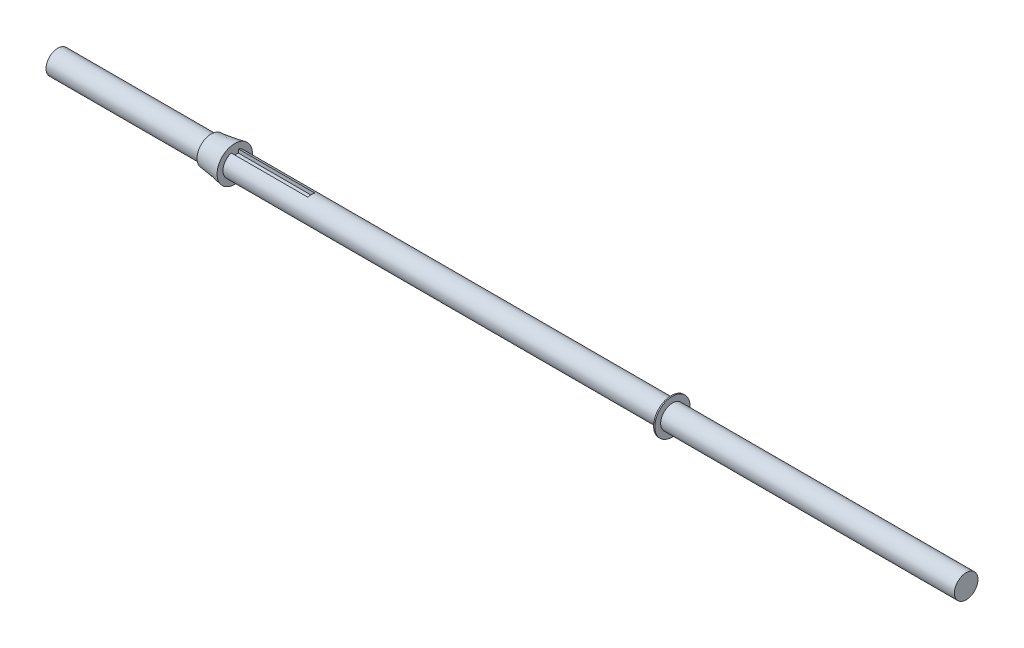
ISO-10303-21;
HEADER;
FILE_DESCRIPTION(('STEP AP214'),'2;1');
FILE_NAME('part.step','',(''),(''),'','','');
FILE_SCHEMA(('AUTOMOTIVE_DESIGN { 1 0 10303 214 1 1 1 1 }'));
ENDSEC;
DATA;
#1=APPLICATION_CONTEXT('core data for automotive mechanical design processes');
#2=APPLICATION_PROTOCOL_DEFINITION('international standard','automotive_design',2000,#1);
#3=PRODUCT_CONTEXT('',#1,'mechanical');
#4=PRODUCT('Part','Part','',(#3));
#5=PRODUCT_RELATED_PRODUCT_CATEGORY('part','',(#4));
#6=PRODUCT_DEFINITION_FORMATION('','',#4);
#7=PRODUCT_DEFINITION_CONTEXT('part definition',#1,'design');
#8=PRODUCT_DEFINITION('design','',#6,#7);
#9=PRODUCT_DEFINITION_SHAPE('','',#8);
#10=(LENGTH_UNIT() NAMED_UNIT(*) SI_UNIT(.MILLI.,.METRE.));
#11=(NAMED_UNIT(*) PLANE_ANGLE_UNIT() SI_UNIT($,.RADIAN.));
#12=(NAMED_UNIT(*) SI_UNIT($,.STERADIAN.) SOLID_ANGLE_UNIT());
#13=UNCERTAINTY_MEASURE_WITH_UNIT(LENGTH_MEASURE(1.E-05),#10,'distance_accuracy_value','');
#14=(GEOMETRIC_REPRESENTATION_CONTEXT(3) GLOBAL_UNCERTAINTY_ASSIGNED_CONTEXT((#13)) GLOBAL_UNIT_ASSIGNED_CONTEXT((#10,
#11,#12)) REPRESENTATION_CONTEXT('',''));
#15=CARTESIAN_POINT('',(0.,0.,0.));
#16=DIRECTION('',(0.,0.,1.));
#17=DIRECTION('',(1.,0.,0.));
#18=AXIS2_PLACEMENT_3D('',#15,#16,#17);
#19=CARTESIAN_POINT('',(750.,0.,0.));
#20=DIRECTION('',(-1.,0.,0.));
#21=DIRECTION('',(0.,0.,1.));
#22=AXIS2_PLACEMENT_3D('',#19,#20,#21);
#23=CYLINDRICAL_SURFACE('',#22,10.);
#24=CARTESIAN_POINT('',(500.,0.,0.));
#25=DIRECTION('',(1.,0.,0.));
#26=DIRECTION('',(0.,0.,-1.));
#27=AXIS2_PLACEMENT_3D('',#24,#25,#26);
#28=CIRCLE('',#27,10.);
#29=CARTESIAN_POINT('',(500.,0.,-10.));
#30=VERTEX_POINT('',#29);
#31=EDGE_CURVE('E57',#30,#30,#28,.T.);
#32=ORIENTED_EDGE('',*,*,#31,.F.);
#33=EDGE_LOOP('',(#32));
#34=FACE_BOUND('',#33,.T.);
#35=DIRECTION('',(-1.,0.,0.));
#36=VECTOR('',#35,1.);
#37=CARTESIAN_POINT('',(750.,9.53939201416946,-3.));
#38=LINE('',#37,#36);
#39=CARTESIAN_POINT('',(195.,9.53939201416946,-3.));
#40=VERTEX_POINT('',#39);
#41=CARTESIAN_POINT('',(130.,9.53939201416946,-3.));
#42=VERTEX_POINT('',#41);
#43=EDGE_CURVE('E115',#40,#42,#38,.T.);
#44=ORIENTED_EDGE('',*,*,#43,.F.);
#45=CARTESIAN_POINT('',(195.,0.,0.));
#46=DIRECTION('',(-1.,0.,0.));
#47=DIRECTION('',(0.,0.,1.));
#48=AXIS2_PLACEMENT_3D('',#45,#46,#47);
#49=CIRCLE('',#48,10.);
#50=CARTESIAN_POINT('',(195.,9.53939201416946,3.));
#51=VERTEX_POINT('',#50);
#52=EDGE_CURVE('E12',#51,#40,#49,.T.);
#53=ORIENTED_EDGE('',*,*,#52,.F.);
#54=DIRECTION('',(-1.,0.,0.));
#55=VECTOR('',#54,1.);
#56=CARTESIAN_POINT('',(750.,9.53939201416946,3.));
#57=LINE('',#56,#55);
#58=CARTESIAN_POINT('',(130.,9.53939201416946,3.));
#59=VERTEX_POINT('',#58);
#60=EDGE_CURVE('E109',#51,#59,#57,.T.);
#61=ORIENTED_EDGE('',*,*,#60,.T.);
#62=CARTESIAN_POINT('',(130.,0.,0.));
#63=DIRECTION('',(1.,0.,0.));
#64=DIRECTION('',(0.,0.,-1.));
#65=AXIS2_PLACEMENT_3D('',#62,#63,#64);
#66=CIRCLE('',#65,10.);
#67=EDGE_CURVE('E207',#59,#42,#66,.T.);
#68=ORIENTED_EDGE('',*,*,#67,.T.);
#69=EDGE_LOOP('',(#44,#53,#61,#68));
#70=FACE_BOUND('',#69,.T.);
#71=ADVANCED_FACE('F48',(#34,#70),#23,.T.);
#72=CARTESIAN_POINT('',(110.,0.,0.));
#73=DIRECTION('',(1.,0.,0.));
#74=DIRECTION('',(0.,0.,-1.));
#75=AXIS2_PLACEMENT_3D('',#72,#73,#74);
#76=CIRCLE('',#75,10.);
#77=CARTESIAN_POINT('',(110.,0.,-10.));
#78=VERTEX_POINT('',#77);
#79=EDGE_CURVE('E214',#78,#78,#76,.T.);
#80=ORIENTED_EDGE('',*,*,#79,.F.);
#81=EDGE_LOOP('',(#80));
#82=FACE_BOUND('',#81,.T.);
#83=CARTESIAN_POINT('',(-20.,0.,0.));
#84=DIRECTION('',(-1.,0.,0.));
#85=DIRECTION('',(0.,0.,1.));
#86=AXIS2_PLACEMENT_3D('',#83,#84,#85);
#87=CIRCLE('',#86,10.);
#88=CARTESIAN_POINT('',(-20.,0.,10.));
#89=VERTEX_POINT('',#88);
#90=EDGE_CURVE('E123',#89,#89,#87,.T.);
#91=ORIENTED_EDGE('',*,*,#90,.F.);
#92=EDGE_LOOP('',(#91));
#93=FACE_BOUND('',#92,.T.);
#94=ADVANCED_FACE('F250',(#82,#93),#23,.T.);
#95=CARTESIAN_POINT('',(110.,0.,0.));
#96=DIRECTION('',(1.,0.,0.));
#97=DIRECTION('',(0.,0.,-1.));
#98=AXIS2_PLACEMENT_3D('',#95,#96,#97);
#99=PLANE('',#98);
#100=ORIENTED_EDGE('',*,*,#79,.T.);
#101=EDGE_LOOP('',(#100));
#102=FACE_BOUND('',#101,.T.);
#103=CARTESIAN_POINT('',(110.,0.,0.));
#104=DIRECTION('',(1.,0.,0.));
#105=DIRECTION('',(0.,0.,-1.));
#106=AXIS2_PLACEMENT_3D('',#103,#104,#105);
#107=CIRCLE('',#106,12.);
#108=CARTESIAN_POINT('',(110.,7.76467153883333,-9.14931013213738));
#109=VERTEX_POINT('',#108);
#110=EDGE_CURVE('E191',#109,#109,#107,.T.);
#111=ORIENTED_EDGE('',*,*,#110,.F.);
#112=EDGE_LOOP('',(#111));
#113=FACE_BOUND('',#112,.T.);
#114=ADVANCED_FACE('F163',(#102,#113),#99,.F.);
#115=CARTESIAN_POINT('',(130.,0.,0.));
#116=DIRECTION('',(1.,0.,0.));
#117=DIRECTION('',(0.,0.,-1.));
#118=AXIS2_PLACEMENT_3D('',#115,#116,#117);
#119=PLANE('',#118);
#120=ORIENTED_EDGE('',*,*,#67,.F.);
#121=DIRECTION('',(0.,1.,0.));
#122=VECTOR('',#121,1.);
#123=CARTESIAN_POINT('',(130.,6.5,3.));
#124=LINE('',#123,#122);
#125=CARTESIAN_POINT('',(130.,6.5,3.));
#126=VERTEX_POINT('',#125);
#127=EDGE_CURVE('E117',#126,#59,#124,.T.);
#128=ORIENTED_EDGE('',*,*,#127,.F.);
#129=DIRECTION('',(0.,0.,-1.));
#130=VECTOR('',#129,1.);
#131=CARTESIAN_POINT('',(130.,6.5,3.));
#132=LINE('',#131,#130);
#133=CARTESIAN_POINT('',(130.,6.5,-3.));
#134=VERTEX_POINT('',#133);
#135=EDGE_CURVE('E366',#126,#134,#132,.T.);
#136=ORIENTED_EDGE('',*,*,#135,.T.);
#137=DIRECTION('',(0.,1.,0.));
#138=VECTOR('',#137,1.);
#139=CARTESIAN_POINT('',(130.,6.5,-3.));
#140=LINE('',#139,#138);
#141=EDGE_CURVE('E64',#134,#42,#140,.T.);
#142=ORIENTED_EDGE('',*,*,#141,.T.);
#143=EDGE_LOOP('',(#120,#128,#136,#142));
#144=FACE_BOUND('',#143,.T.);
#145=CARTESIAN_POINT('',(130.,0.,0.));
#146=DIRECTION('',(1.,0.,0.));
#147=DIRECTION('',(0.,0.,-1.));
#148=AXIS2_PLACEMENT_3D('',#145,#146,#147);
#149=CIRCLE('',#148,15.);
#150=CARTESIAN_POINT('',(130.,13.4202752725021,-6.70046353697026));
#151=VERTEX_POINT('',#150);
#152=EDGE_CURVE('E140',#151,#151,#149,.T.);
#153=ORIENTED_EDGE('',*,*,#152,.T.);
#154=EDGE_LOOP('',(#153));
#155=FACE_BOUND('',#154,.T.);
#156=ADVANCED_FACE('F160',(#144,#155),#119,.T.);
#157=CARTESIAN_POINT('',(130.,13.4202752725021,-6.70046353697026));
#158=CARTESIAN_POINT('',(110.,7.76467153883333,-9.14931013213738));
#159=CARTESIAN_POINT('',(130.,0.0193481985615966,-33.5410140819745));
#160=CARTESIAN_POINT('',(110.,-10.5339487254414,-24.678653209804));
#161=CARTESIAN_POINT('',(130.,-26.8212023464427,-20.140087008034));
#162=CARTESIAN_POINT('',(110.,-26.0632918031081,-6.38003294552928));
#163=CARTESIAN_POINT('',(130.,-13.4202752725021,6.70046353697027));
#164=CARTESIAN_POINT('',(110.,-7.76467153883333,9.14931013213738));
#165=CARTESIAN_POINT('',(130.,-0.0193481985615931,33.5410140819745));
#166=CARTESIAN_POINT('',(110.,10.5339487254414,24.678653209804));
#167=CARTESIAN_POINT('',(130.,26.8212023464427,20.140087008034));
#168=CARTESIAN_POINT('',(110.,26.0632918031081,6.38003294552929));
#169=CARTESIAN_POINT('',(130.,13.4202752725021,-6.70046353697026));
#170=CARTESIAN_POINT('',(110.,7.76467153883333,-9.14931013213738));
#171=(BOUNDED_SURFACE() B_SPLINE_SURFACE(3,1,((#157,#158),(#159,#160),(#161,#162),(#163,#164),
(#165,#166),(#167,#168),(#169,#170)),.UNSPECIFIED.,.T.,.F.,.F.) B_SPLINE_SURFACE_WITH_KNOTS((4,
3,4),(2,2),(0.,0.5,1.),(0.,1.),
.UNSPECIFIED.) GEOMETRIC_REPRESENTATION_ITEM() RATIONAL_B_SPLINE_SURFACE(((1.,1.),
(0.333333333333333,0.333333333333333),(0.333333333333333,0.333333333333333),(1.,1.),
(0.333333333333333,0.333333333333333),(0.333333333333333,0.333333333333333),(1.,1.))) REPRESENTATION_ITEM('') SURFACE());
#172=CARTESIAN_POINT('',(130.,13.4202752725021,-6.70046353697026));
#173=CARTESIAN_POINT('',(129.791666666667,13.3613627336097,-6.72597235566992));
#174=CARTESIAN_POINT('',(129.583333333333,13.3024501947174,-6.75148117436958));
#175=CARTESIAN_POINT('',(129.166666666667,13.1846251169326,-6.80249881176889));
#176=CARTESIAN_POINT('',(128.958333333333,13.1257125780402,-6.82800763046855));
#177=CARTESIAN_POINT('',(128.541666666667,13.0078875002554,-6.87902526786787));
#178=CARTESIAN_POINT('',(128.333333333333,12.9489749613631,-6.90453408656752));
#179=CARTESIAN_POINT('',(127.916666666667,12.8311498835783,-6.95555172396684));
#180=CARTESIAN_POINT('',(127.708333333333,12.7722373446859,-6.9810605426665));
#181=CARTESIAN_POINT('',(127.291666666667,12.6544122669011,-7.03207818006581));
#182=CARTESIAN_POINT('',(127.083333333333,12.5954997280088,-7.05758699876547));
#183=CARTESIAN_POINT('',(126.666666666667,12.477674650224,-7.10860463616478));
#184=CARTESIAN_POINT('',(126.458333333333,12.4187621113316,-7.13411345486444));
#185=CARTESIAN_POINT('',(126.041666666667,12.3009370335468,-7.18513109226376));
#186=CARTESIAN_POINT('',(125.833333333333,12.2420244946545,-7.21063991096341));
#187=CARTESIAN_POINT('',(125.416666666667,12.1241994168697,-7.26165754836273));
#188=CARTESIAN_POINT('',(125.208333333333,12.0652868779773,-7.28716636706238));
#189=CARTESIAN_POINT('',(124.791666666667,11.9474618001925,-7.3381840044617));
#190=CARTESIAN_POINT('',(124.583333333333,11.8885492613002,-7.36369282316136));
#191=CARTESIAN_POINT('',(124.166666666667,11.7707241835154,-7.41471046056067));
#192=CARTESIAN_POINT('',(123.958333333333,11.711811644623,-7.44021927926033));
#193=CARTESIAN_POINT('',(123.541666666667,11.5939865668382,-7.49123691665964));
#194=CARTESIAN_POINT('',(123.333333333333,11.5350740279459,-7.5167457353593));
#195=CARTESIAN_POINT('',(122.916666666667,11.4172489501611,-7.56776337275862));
#196=CARTESIAN_POINT('',(122.708333333333,11.3583364112687,-7.59327219145827));
#197=CARTESIAN_POINT('',(122.291666666667,11.2405113334839,-7.64428982885759));
#198=CARTESIAN_POINT('',(122.083333333333,11.1815987945916,-7.66979864755725));
#199=CARTESIAN_POINT('',(121.666666666667,11.0637737168068,-7.72081628495656));
#200=CARTESIAN_POINT('',(121.458333333333,11.0048611779144,-7.74632510365622));
#201=CARTESIAN_POINT('',(121.041666666667,10.8870361001296,-7.79734274105553));
#202=CARTESIAN_POINT('',(120.833333333333,10.8281235612373,-7.82285155975519));
#203=CARTESIAN_POINT('',(120.416666666667,10.7102984834525,-7.87386919715451));
#204=CARTESIAN_POINT('',(120.208333333333,10.6513859445601,-7.89937801585416));
#205=CARTESIAN_POINT('',(119.791666666667,10.5335608667753,-7.95039565325348));
#206=CARTESIAN_POINT('',(119.583333333333,10.474648327883,-7.97590447195314));
#207=CARTESIAN_POINT('',(119.166666666667,10.3568232500982,-8.02692210935245));
#208=CARTESIAN_POINT('',(118.958333333333,10.2979107112058,-8.05243092805211));
#209=CARTESIAN_POINT('',(118.541666666667,10.180085633421,-8.10344856545142));
#210=CARTESIAN_POINT('',(118.333333333333,10.1211730945287,-8.12895738415108));
#211=CARTESIAN_POINT('',(117.916666666667,10.0033480167439,-8.1799750215504));
#212=CARTESIAN_POINT('',(117.708333333333,9.94443547785151,-8.20548384025005));
#213=CARTESIAN_POINT('',(117.291666666667,9.82661040006674,-8.25650147764937));
#214=CARTESIAN_POINT('',(117.083333333333,9.76769786117436,-8.28201029634902));
#215=CARTESIAN_POINT('',(116.666666666667,9.64987278338959,-8.33302793374834));
#216=CARTESIAN_POINT('',(116.458333333333,9.59096024449721,-8.358536752448));
#217=CARTESIAN_POINT('',(116.041666666667,9.47313516671244,-8.40955438984731));
#218=CARTESIAN_POINT('',(115.833333333333,9.41422262782006,-8.43506320854697));
#219=CARTESIAN_POINT('',(115.416666666667,9.29639755003529,-8.48608084594628));
#220=CARTESIAN_POINT('',(115.208333333333,9.23748501114291,-8.51158966464594));
#221=CARTESIAN_POINT('',(114.791666666667,9.11965993335814,-8.56260730204526));
#222=CARTESIAN_POINT('',(114.583333333333,9.06074739446576,-8.58811612074491));
#223=CARTESIAN_POINT('',(114.166666666667,8.942922316681,-8.63913375814423));
#224=CARTESIAN_POINT('',(113.958333333333,8.88400977778861,-8.66464257684389));
#225=CARTESIAN_POINT('',(113.541666666667,8.76618470000385,-8.7156602142432));
#226=CARTESIAN_POINT('',(113.333333333333,8.70727216111146,-8.74116903294286));
#227=CARTESIAN_POINT('',(112.916666666667,8.58944708332669,-8.79218667034217));
#228=CARTESIAN_POINT('',(112.708333333333,8.53053454443431,-8.81769548904183));
#229=CARTESIAN_POINT('',(112.291666666667,8.41270946664955,-8.86871312644115));
#230=CARTESIAN_POINT('',(112.083333333333,8.35379692775716,-8.8942219451408));
#231=CARTESIAN_POINT('',(111.666666666667,8.2359718499724,-8.94523958254012));
#232=CARTESIAN_POINT('',(111.458333333333,8.17705931108001,-8.97074840123977));
#233=CARTESIAN_POINT('',(111.041666666667,8.05923423329525,-9.02176603863909));
#234=CARTESIAN_POINT('',(110.833333333333,8.00032169440286,-9.04727485733875));
#235=CARTESIAN_POINT('',(110.416666666667,7.88249661661809,-9.09829249473807));
#236=CARTESIAN_POINT('',(110.208333333333,7.82358407772571,-9.12380131343772));
#237=CARTESIAN_POINT('',(110.,7.76467153883333,-9.14931013213738));
#238=B_SPLINE_CURVE_WITH_KNOTS('',3,(#172,#173,#174,#175,#176,#177,#178,#179,#180,#181,#182,
#183,#184,#185,#186,#187,#188,#189,#190,#191,#192,#193,#194,#195,#196,#197,#198,#199,#200,#201,
#202,#203,#204,#205,#206,#207,#208,#209,#210,#211,#212,#213,#214,#215,#216,#217,#218,#219,#220,
#221,#222,#223,#224,#225,#226,#227,#228,#229,#230,#231,#232,#233,#234,#235,#236,#237),
.UNSPECIFIED.,.F.,.F.,(4,2,2,2,2,2,2,2,2,2,2,2,2,2,2,2,2,2,2,2,2,2,2,2,2,2,2,2,2,2,2,2,4),(0.,
0.65400113427407,1.30800226854817,1.96200340282226,2.61600453709633,3.2700056713704,
3.9240068056445,4.5780079399186,5.23200907419267,5.88601020846674,6.54001134274082,
7.19401247701492,7.848013611289,8.50201474556307,9.15601587983717,9.81001701411125,
10.4640181483853,11.1180192826594,11.7720204169335,12.4260215512076,13.0800226854817,
13.7340238197557,14.3880249540298,15.0420260883039,15.696027222578,16.3500283568521,
17.0040294911262,17.6580306254002,18.3120317596743,18.9660328939484,19.6200340282225,
20.2740351624966,20.9280362967706),.UNSPECIFIED.);
#239=EDGE_CURVE('BSEAM147',#151,#109,#238,.T.);
#240=ORIENTED_EDGE('',*,*,#152,.F.);
#241=ORIENTED_EDGE('',*,*,#110,.T.);
#242=ORIENTED_EDGE('',*,*,#239,.T.);
#243=ORIENTED_EDGE('',*,*,#239,.F.);
#244=EDGE_LOOP('',(#240,#242,#241,#243));
#245=FACE_BOUND('',#244,.T.);
#246=ADVANCED_FACE('F147',(#245),#171,.T.);
#247=CARTESIAN_POINT('',(501.,0.,0.));
#248=DIRECTION('',(-1.,0.,0.));
#249=DIRECTION('',(0.,0.,1.));
#250=AXIS2_PLACEMENT_3D('',#247,#248,#249);
#251=CYLINDRICAL_SURFACE('',#250,15.);
#252=CARTESIAN_POINT('',(501.,0.,0.));
#253=DIRECTION('',(1.,0.,0.));
#254=DIRECTION('',(0.,0.,-1.));
#255=AXIS2_PLACEMENT_3D('',#252,#253,#254);
#256=CIRCLE('',#255,15.);
#257=CARTESIAN_POINT('',(501.,0.,-15.));
#258=VERTEX_POINT('',#257);
#259=EDGE_CURVE('E128',#258,#258,#256,.T.);
#260=ORIENTED_EDGE('',*,*,#259,.F.);
#261=EDGE_LOOP('',(#260));
#262=FACE_BOUND('',#261,.T.);
#263=CARTESIAN_POINT('',(500.,0.,0.));
#264=DIRECTION('',(1.,0.,0.));
#265=DIRECTION('',(0.,0.,-1.));
#266=AXIS2_PLACEMENT_3D('',#263,#264,#265);
#267=CIRCLE('',#266,15.);
#268=CARTESIAN_POINT('',(500.,0.,-15.));
#269=VERTEX_POINT('',#268);
#270=EDGE_CURVE('E127',#269,#269,#267,.T.);
#271=ORIENTED_EDGE('',*,*,#270,.T.);
#272=EDGE_LOOP('',(#271));
#273=FACE_BOUND('',#272,.T.);
#274=ADVANCED_FACE('F159',(#262,#273),#251,.T.);
#275=CARTESIAN_POINT('',(501.,0.,0.));
#276=DIRECTION('',(1.,0.,0.));
#277=DIRECTION('',(0.,0.,-1.));
#278=AXIS2_PLACEMENT_3D('',#275,#276,#277);
#279=PLANE('',#278);
#280=CARTESIAN_POINT('',(501.,0.,0.));
#281=DIRECTION('',(1.,0.,0.));
#282=DIRECTION('',(0.,0.,-1.));
#283=AXIS2_PLACEMENT_3D('',#280,#281,#282);
#284=CIRCLE('',#283,10.);
#285=CARTESIAN_POINT('',(501.,0.,-10.));
#286=VERTEX_POINT('',#285);
#287=EDGE_CURVE('E132',#286,#286,#284,.T.);
#288=ORIENTED_EDGE('',*,*,#287,.F.);
#289=EDGE_LOOP('',(#288));
#290=FACE_BOUND('',#289,.T.);
#291=ORIENTED_EDGE('',*,*,#259,.T.);
#292=EDGE_LOOP('',(#291));
#293=FACE_BOUND('',#292,.T.);
#294=ADVANCED_FACE('F229',(#290,#293),#279,.T.);
#295=CARTESIAN_POINT('',(500.,0.,0.));
#296=DIRECTION('',(1.,0.,0.));
#297=DIRECTION('',(0.,0.,-1.));
#298=AXIS2_PLACEMENT_3D('',#295,#296,#297);
#299=PLANE('',#298);
#300=ORIENTED_EDGE('',*,*,#31,.T.);
#301=EDGE_LOOP('',(#300));
#302=FACE_BOUND('',#301,.T.);
#303=ORIENTED_EDGE('',*,*,#270,.F.);
#304=EDGE_LOOP('',(#303));
#305=FACE_BOUND('',#304,.T.);
#306=ADVANCED_FACE('F232',(#302,#305),#299,.F.);
#307=CARTESIAN_POINT('',(750.,0.,0.));
#308=DIRECTION('',(1.,0.,0.));
#309=DIRECTION('',(0.,0.,-1.));
#310=AXIS2_PLACEMENT_3D('',#307,#308,#309);
#311=PLANE('',#310);
#312=CARTESIAN_POINT('',(750.,0.,0.));
#313=DIRECTION('',(1.,0.,0.));
#314=DIRECTION('',(0.,0.,-1.));
#315=AXIS2_PLACEMENT_3D('',#312,#313,#314);
#316=CIRCLE('',#315,10.);
#317=CARTESIAN_POINT('',(750.,0.,-10.));
#318=VERTEX_POINT('',#317);
#319=EDGE_CURVE('E210',#318,#318,#316,.T.);
#320=ORIENTED_EDGE('',*,*,#319,.T.);
#321=EDGE_LOOP('',(#320));
#322=FACE_BOUND('',#321,.T.);
#323=ADVANCED_FACE('F241',(#322),#311,.T.);
#324=ORIENTED_EDGE('',*,*,#287,.T.);
#325=EDGE_LOOP('',(#324));
#326=FACE_BOUND('',#325,.T.);
#327=ORIENTED_EDGE('',*,*,#319,.F.);
#328=EDGE_LOOP('',(#327));
#329=FACE_BOUND('',#328,.T.);
#330=ADVANCED_FACE('F50',(#326,#329),#23,.T.);
#331=CARTESIAN_POINT('',(-20.,0.,0.));
#332=DIRECTION('',(-1.,0.,0.));
#333=DIRECTION('',(0.,0.,1.));
#334=AXIS2_PLACEMENT_3D('',#331,#332,#333);
#335=PLANE('',#334);
#336=ORIENTED_EDGE('',*,*,#90,.T.);
#337=EDGE_LOOP('',(#336));
#338=FACE_BOUND('',#337,.T.);
#339=ADVANCED_FACE('F260',(#338),#335,.T.);
#340=CARTESIAN_POINT('',(195.,6.5,-3.));
#341=DIRECTION('',(-1.,0.,0.));
#342=DIRECTION('',(0.,0.,1.));
#343=AXIS2_PLACEMENT_3D('',#340,#341,#342);
#344=PLANE('',#343);
#345=ORIENTED_EDGE('',*,*,#52,.T.);
#346=DIRECTION('',(0.,1.,0.));
#347=VECTOR('',#346,1.);
#348=CARTESIAN_POINT('',(195.,6.5,-3.));
#349=LINE('',#348,#347);
#350=CARTESIAN_POINT('',(195.,6.5,-3.));
#351=VERTEX_POINT('',#350);
#352=EDGE_CURVE('E103',#351,#40,#349,.T.);
#353=ORIENTED_EDGE('',*,*,#352,.F.);
#354=DIRECTION('',(0.,0.,1.));
#355=VECTOR('',#354,1.);
#356=CARTESIAN_POINT('',(195.,6.5,-3.));
#357=LINE('',#356,#355);
#358=CARTESIAN_POINT('',(195.,6.5,3.));
#359=VERTEX_POINT('',#358);
#360=EDGE_CURVE('E91',#351,#359,#357,.T.);
#361=ORIENTED_EDGE('',*,*,#360,.T.);
#362=DIRECTION('',(0.,1.,0.));
#363=VECTOR('',#362,1.);
#364=CARTESIAN_POINT('',(195.,6.5,3.));
#365=LINE('',#364,#363);
#366=EDGE_CURVE('E110',#359,#51,#365,.T.);
#367=ORIENTED_EDGE('',*,*,#366,.T.);
#368=EDGE_LOOP('',(#345,#353,#361,#367));
#369=FACE_BOUND('',#368,.T.);
#370=ADVANCED_FACE('F107',(#369),#344,.T.);
#371=CARTESIAN_POINT('',(130.,6.5,-3.));
#372=DIRECTION('',(0.,0.,1.));
#373=DIRECTION('',(1.,0.,0.));
#374=AXIS2_PLACEMENT_3D('',#371,#372,#373);
#375=PLANE('',#374);
#376=ORIENTED_EDGE('',*,*,#43,.T.);
#377=ORIENTED_EDGE('',*,*,#141,.F.);
#378=DIRECTION('',(1.,0.,0.));
#379=VECTOR('',#378,1.);
#380=CARTESIAN_POINT('',(130.,6.5,-3.));
#381=LINE('',#380,#379);
#382=EDGE_CURVE('E95',#134,#351,#381,.T.);
#383=ORIENTED_EDGE('',*,*,#382,.T.);
#384=ORIENTED_EDGE('',*,*,#352,.T.);
#385=EDGE_LOOP('',(#376,#377,#383,#384));
#386=FACE_BOUND('',#385,.T.);
#387=ADVANCED_FACE('F102',(#386),#375,.T.);
#388=CARTESIAN_POINT('',(130.,6.5,3.));
#389=DIRECTION('',(0.,0.,1.));
#390=DIRECTION('',(1.,0.,0.));
#391=AXIS2_PLACEMENT_3D('',#388,#389,#390);
#392=PLANE('',#391);
#393=ORIENTED_EDGE('',*,*,#366,.F.);
#394=DIRECTION('',(1.,0.,0.));
#395=VECTOR('',#394,1.);
#396=CARTESIAN_POINT('',(130.,6.5,3.));
#397=LINE('',#396,#395);
#398=EDGE_CURVE('E97',#126,#359,#397,.T.);
#399=ORIENTED_EDGE('',*,*,#398,.F.);
#400=ORIENTED_EDGE('',*,*,#127,.T.);
#401=ORIENTED_EDGE('',*,*,#60,.F.);
#402=EDGE_LOOP('',(#393,#399,#400,#401));
#403=FACE_BOUND('',#402,.T.);
#404=ADVANCED_FACE('F271',(#403),#392,.F.);
#405=CARTESIAN_POINT('',(0.,6.5,0.));
#406=DIRECTION('',(0.,-1.,0.));
#407=DIRECTION('',(0.,0.,-1.));
#408=AXIS2_PLACEMENT_3D('',#405,#406,#407);
#409=PLANE('',#408);
#410=ORIENTED_EDGE('',*,*,#382,.F.);
#411=ORIENTED_EDGE('',*,*,#135,.F.);
#412=ORIENTED_EDGE('',*,*,#398,.T.);
#413=ORIENTED_EDGE('',*,*,#360,.F.);
#414=EDGE_LOOP('',(#410,#411,#412,#413));
#415=FACE_BOUND('',#414,.T.);
#416=ADVANCED_FACE('F93',(#415),#409,.F.);
#417=CLOSED_SHELL('',(#71,#94,#114,#156,#246,#274,#294,#306,#323,#330,#339,#370,#387,#404,#416));
#418=MANIFOLD_SOLID_BREP('B2',#417);
#419=ADVANCED_BREP_SHAPE_REPRESENTATION('',(#18,#418),#14);
#420=SHAPE_DEFINITION_REPRESENTATION(#9,#419);
ENDSEC;
END-ISO-10303-21;
